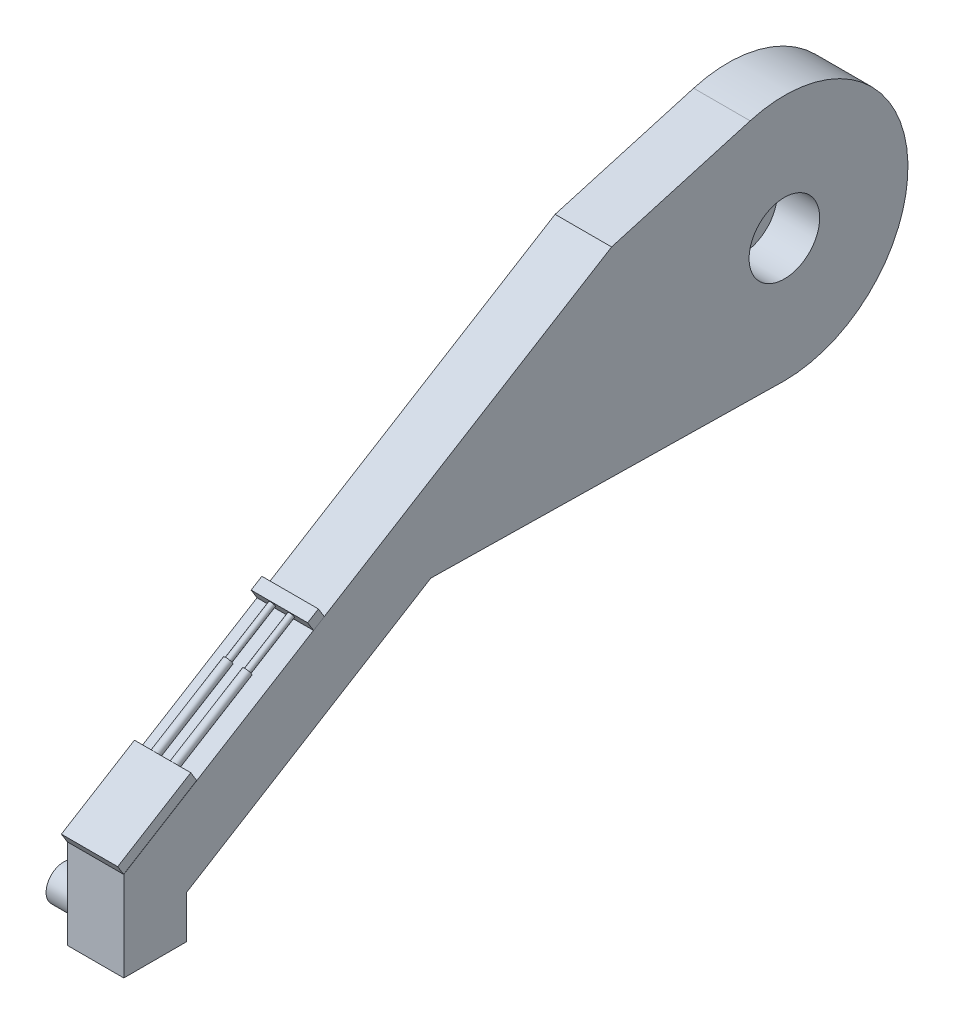
ISO-10303-21;
HEADER;
FILE_DESCRIPTION(('STEP AP214'),'2;1');
FILE_NAME('part.step','',(''),(''),'','','');
FILE_SCHEMA(('AUTOMOTIVE_DESIGN { 1 0 10303 214 1 1 1 1 }'));
ENDSEC;
DATA;
#1=APPLICATION_CONTEXT('core data for automotive mechanical design processes');
#2=APPLICATION_PROTOCOL_DEFINITION('international standard','automotive_design',2000,#1);
#3=PRODUCT_CONTEXT('',#1,'mechanical');
#4=PRODUCT('Part','Part','',(#3));
#5=PRODUCT_RELATED_PRODUCT_CATEGORY('part','',(#4));
#6=PRODUCT_DEFINITION_FORMATION('','',#4);
#7=PRODUCT_DEFINITION_CONTEXT('part definition',#1,'design');
#8=PRODUCT_DEFINITION('design','',#6,#7);
#9=PRODUCT_DEFINITION_SHAPE('','',#8);
#10=(LENGTH_UNIT() NAMED_UNIT(*) SI_UNIT(.MILLI.,.METRE.));
#11=(NAMED_UNIT(*) PLANE_ANGLE_UNIT() SI_UNIT($,.RADIAN.));
#12=(NAMED_UNIT(*) SI_UNIT($,.STERADIAN.) SOLID_ANGLE_UNIT());
#13=UNCERTAINTY_MEASURE_WITH_UNIT(LENGTH_MEASURE(1.E-05),#10,'distance_accuracy_value','');
#14=(GEOMETRIC_REPRESENTATION_CONTEXT(3) GLOBAL_UNCERTAINTY_ASSIGNED_CONTEXT((#13)) GLOBAL_UNIT_ASSIGNED_CONTEXT((#10,
#11,#12)) REPRESENTATION_CONTEXT('',''));
#15=CARTESIAN_POINT('',(0.,0.,0.));
#16=DIRECTION('',(0.,0.,1.));
#17=DIRECTION('',(1.,0.,0.));
#18=AXIS2_PLACEMENT_3D('',#15,#16,#17);
#19=CARTESIAN_POINT('',(80.,243.860961506672,-135.556846967238));
#20=DIRECTION('',(0.,-0.852159096550668,-0.523282786040158));
#21=DIRECTION('',(0.,0.523282786040158,-0.852159096550668));
#22=AXIS2_PLACEMENT_3D('',#19,#20,#21);
#23=PLANE('',#22);
#24=DIRECTION('',(0.,0.523282786040158,-0.852159096550668));
#25=VECTOR('',#24,1.);
#26=CARTESIAN_POINT('',(79.7425631618783,-116.81087603216,451.792470510164));
#27=LINE('',#26,#25);
#28=CARTESIAN_POINT('',(79.7425631618784,-180.334724000106,555.240216810827));
#29=VERTEX_POINT('',#28);
#30=CARTESIAN_POINT('',(79.7425631618783,-116.81087603216,451.792470510164));
#31=VERTEX_POINT('',#30);
#32=EDGE_CURVE('E71',#29,#31,#27,.T.);
#33=ORIENTED_EDGE('',*,*,#32,.F.);
#34=DIRECTION('',(-1.,0.,0.));
#35=VECTOR('',#34,1.);
#36=CARTESIAN_POINT('',(80.,-180.334724000106,555.240216810827));
#37=LINE('',#36,#35);
#38=CARTESIAN_POINT('',(80.,-180.334724000106,555.240216810827));
#39=VERTEX_POINT('',#38);
#40=EDGE_CURVE('E334',#39,#29,#37,.T.);
#41=ORIENTED_EDGE('',*,*,#40,.F.);
#42=DIRECTION('',(0.,-0.523282786040158,0.852159096550668));
#43=VECTOR('',#42,1.);
#44=CARTESIAN_POINT('',(80.,243.860961506672,-135.556846967238));
#45=LINE('',#44,#43);
#46=CARTESIAN_POINT('',(80.,-15.3543945600017,286.571932214281));
#47=VERTEX_POINT('',#46);
#48=EDGE_CURVE('E271',#47,#39,#45,.T.);
#49=ORIENTED_EDGE('',*,*,#48,.F.);
#50=DIRECTION('',(1.,0.,0.));
#51=VECTOR('',#50,1.);
#52=CARTESIAN_POINT('',(80.0913915254862,-15.3543945600017,286.571932214281));
#53=LINE('',#52,#51);
#54=CARTESIAN_POINT('',(0.,-15.3543945600017,286.571932214281));
#55=VERTEX_POINT('',#54);
#56=EDGE_CURVE('E234',#55,#47,#53,.T.);
#57=ORIENTED_EDGE('',*,*,#56,.F.);
#58=DIRECTION('',(0.,-0.523282786040158,0.852159096550668));
#59=VECTOR('',#58,1.);
#60=CARTESIAN_POINT('',(0.,243.860961506672,-135.556846967238));
#61=LINE('',#60,#59);
#62=CARTESIAN_POINT('',(0.,-116.81087603216,451.792470510164));
#63=VERTEX_POINT('',#62);
#64=EDGE_CURVE('E298',#55,#63,#61,.T.);
#65=ORIENTED_EDGE('',*,*,#64,.T.);
#66=DIRECTION('',(-1.,0.,0.));
#67=VECTOR('',#66,1.);
#68=CARTESIAN_POINT('',(79.7425631618783,-116.81087603216,451.792470510164));
#69=LINE('',#68,#67);
#70=EDGE_CURVE('E67',#31,#63,#69,.T.);
#71=ORIENTED_EDGE('',*,*,#70,.F.);
#72=EDGE_LOOP('',(#33,#41,#49,#57,#65,#71));
#73=FACE_BOUND('',#72,.T.);
#74=ADVANCED_FACE('F51',(#73),#23,.F.);
#75=DIRECTION('',(-1.,0.,0.));
#76=VECTOR('',#75,1.);
#77=CARTESIAN_POINT('',(80.0913915254862,-6.01484112769533,271.362592967165));
#78=LINE('',#77,#76);
#79=CARTESIAN_POINT('',(80.,-6.01484112769537,271.362592967165));
#80=VERTEX_POINT('',#79);
#81=CARTESIAN_POINT('',(0.,-6.01484112769537,271.362592967165));
#82=VERTEX_POINT('',#81);
#83=EDGE_CURVE('E230',#80,#82,#78,.T.);
#84=ORIENTED_EDGE('',*,*,#83,.F.);
#85=CARTESIAN_POINT('',(80.,243.860961506672,-135.556846967238));
#86=VERTEX_POINT('',#85);
#87=EDGE_CURVE('E272',#86,#80,#45,.T.);
#88=ORIENTED_EDGE('',*,*,#87,.F.);
#89=DIRECTION('',(-1.,0.,0.));
#90=VECTOR('',#89,1.);
#91=CARTESIAN_POINT('',(80.,243.860961506672,-135.556846967238));
#92=LINE('',#91,#90);
#93=CARTESIAN_POINT('',(0.,243.860961506672,-135.556846967238));
#94=VERTEX_POINT('',#93);
#95=EDGE_CURVE('E337',#86,#94,#92,.T.);
#96=ORIENTED_EDGE('',*,*,#95,.T.);
#97=EDGE_CURVE('E299',#94,#82,#61,.T.);
#98=ORIENTED_EDGE('',*,*,#97,.T.);
#99=EDGE_LOOP('',(#84,#88,#96,#98));
#100=FACE_BOUND('',#99,.T.);
#101=ADVANCED_FACE('F417',(#100),#23,.F.);
#102=CARTESIAN_POINT('',(80.,132.309134609545,-380.240216810827));
#103=DIRECTION('',(-1.,0.,0.));
#104=DIRECTION('',(0.,0.,1.));
#105=AXIS2_PLACEMENT_3D('',#102,#103,#104);
#106=CYLINDRICAL_SURFACE('',#105,175.);
#107=CARTESIAN_POINT('',(0.,132.309134609545,-380.240216810827));
#108=DIRECTION('',(1.,0.,0.));
#109=DIRECTION('',(0.,0.,-1.));
#110=AXIS2_PLACEMENT_3D('',#107,#108,#109);
#111=CIRCLE('',#110,175.);
#112=CARTESIAN_POINT('',(0.,-42.6908653904551,-380.240216810827));
#113=VERTEX_POINT('',#112);
#114=CARTESIAN_POINT('',(0.,300.452842372266,-331.735644451053));
#115=VERTEX_POINT('',#114);
#116=EDGE_CURVE('E259',#113,#115,#111,.T.);
#117=ORIENTED_EDGE('',*,*,#116,.T.);
#118=DIRECTION('',(-1.,0.,0.));
#119=VECTOR('',#118,1.);
#120=CARTESIAN_POINT('',(80.,300.452842372266,-331.735644451053));
#121=LINE('',#120,#119);
#122=CARTESIAN_POINT('',(80.,300.452842372266,-331.735644451053));
#123=VERTEX_POINT('',#122);
#124=EDGE_CURVE('E341',#123,#115,#121,.T.);
#125=ORIENTED_EDGE('',*,*,#124,.F.);
#126=CARTESIAN_POINT('',(80.,132.309134609545,-380.240216810827));
#127=DIRECTION('',(1.,0.,0.));
#128=DIRECTION('',(0.,0.,-1.));
#129=AXIS2_PLACEMENT_3D('',#126,#127,#128);
#130=CIRCLE('',#129,175.);
#131=CARTESIAN_POINT('',(80.,-42.6908653904551,-380.240216810827));
#132=VERTEX_POINT('',#131);
#133=EDGE_CURVE('E263',#132,#123,#130,.T.);
#134=ORIENTED_EDGE('',*,*,#133,.F.);
#135=DIRECTION('',(-1.,0.,0.));
#136=VECTOR('',#135,1.);
#137=CARTESIAN_POINT('',(80.,-42.6908653904551,-380.240216810827));
#138=LINE('',#137,#136);
#139=EDGE_CURVE('E291',#132,#113,#138,.T.);
#140=ORIENTED_EDGE('',*,*,#139,.T.);
#141=EDGE_LOOP('',(#117,#125,#134,#140));
#142=FACE_BOUND('',#141,.T.);
#143=ADVANCED_FACE('F53',(#142),#106,.T.);
#144=CARTESIAN_POINT('',(80.,300.452842372266,-331.735644451053));
#145=DIRECTION('',(0.,-0.96082118721555,-0.277168984912997));
#146=DIRECTION('',(0.,0.277168984912997,-0.96082118721555));
#147=AXIS2_PLACEMENT_3D('',#144,#145,#146);
#148=PLANE('',#147);
#149=DIRECTION('',(0.,-0.277168984912997,0.96082118721555));
#150=VECTOR('',#149,1.);
#151=CARTESIAN_POINT('',(0.,300.452842372266,-331.735644451053));
#152=LINE('',#151,#150);
#153=EDGE_CURVE('E295',#115,#94,#152,.T.);
#154=ORIENTED_EDGE('',*,*,#153,.T.);
#155=ORIENTED_EDGE('',*,*,#95,.F.);
#156=DIRECTION('',(0.,-0.277168984912997,0.96082118721555));
#157=VECTOR('',#156,1.);
#158=CARTESIAN_POINT('',(80.,300.452842372266,-331.735644451053));
#159=LINE('',#158,#157);
#160=EDGE_CURVE('E267',#123,#86,#159,.T.);
#161=ORIENTED_EDGE('',*,*,#160,.F.);
#162=ORIENTED_EDGE('',*,*,#124,.T.);
#163=EDGE_LOOP('',(#154,#155,#161,#162));
#164=FACE_BOUND('',#163,.T.);
#165=ADVANCED_FACE('F426',(#164),#148,.F.);
#166=CARTESIAN_POINT('',(80.,-180.334724000106,555.240216810827));
#167=DIRECTION('',(0.,0.,-1.));
#168=DIRECTION('',(-1.,0.,0.));
#169=AXIS2_PLACEMENT_3D('',#166,#167,#168);
#170=PLANE('',#169);
#171=DIRECTION('',(0.,-1.,0.));
#172=VECTOR('',#171,1.);
#173=CARTESIAN_POINT('',(0.,-180.334724000106,555.240216810827));
#174=LINE('',#173,#172);
#175=CARTESIAN_POINT('',(0.,-180.334724000106,555.240216810827));
#176=VERTEX_POINT('',#175);
#177=CARTESIAN_POINT('',(0.,-307.309134609545,555.240216810827));
#178=VERTEX_POINT('',#177);
#179=EDGE_CURVE('E193',#176,#178,#174,.T.);
#180=ORIENTED_EDGE('',*,*,#179,.T.);
#181=DIRECTION('',(-1.,0.,0.));
#182=VECTOR('',#181,1.);
#183=CARTESIAN_POINT('',(80.,-307.309134609545,555.240216810827));
#184=LINE('',#183,#182);
#185=CARTESIAN_POINT('',(80.,-307.309134609545,555.240216810827));
#186=VERTEX_POINT('',#185);
#187=EDGE_CURVE('E330',#186,#178,#184,.T.);
#188=ORIENTED_EDGE('',*,*,#187,.F.);
#189=DIRECTION('',(0.,-1.,0.));
#190=VECTOR('',#189,1.);
#191=CARTESIAN_POINT('',(80.,-180.334724000106,555.240216810827));
#192=LINE('',#191,#190);
#193=EDGE_CURVE('E276',#39,#186,#192,.T.);
#194=ORIENTED_EDGE('',*,*,#193,.F.);
#195=ORIENTED_EDGE('',*,*,#40,.T.);
#196=DIRECTION('',(1.,0.,0.));
#197=VECTOR('',#196,1.);
#198=CARTESIAN_POINT('',(79.7425631618784,-180.334724000106,555.240216810827));
#199=LINE('',#198,#197);
#200=EDGE_CURVE('E238',#176,#29,#199,.T.);
#201=ORIENTED_EDGE('',*,*,#200,.F.);
#202=EDGE_LOOP('',(#180,#188,#194,#195,#201));
#203=FACE_BOUND('',#202,.T.);
#204=ADVANCED_FACE('F424',(#203),#170,.F.);
#205=CARTESIAN_POINT('',(80.,-307.309134609545,555.240216810827));
#206=DIRECTION('',(0.,1.,0.));
#207=DIRECTION('',(0.,0.,1.));
#208=AXIS2_PLACEMENT_3D('',#205,#206,#207);
#209=PLANE('',#208);
#210=DIRECTION('',(0.,0.,-1.));
#211=VECTOR('',#210,1.);
#212=CARTESIAN_POINT('',(0.,-307.309134609545,555.240216810827));
#213=LINE('',#212,#211);
#214=CARTESIAN_POINT('',(0.,-307.309134609545,466.406773100588));
#215=VERTEX_POINT('',#214);
#216=EDGE_CURVE('E304',#178,#215,#213,.T.);
#217=ORIENTED_EDGE('',*,*,#216,.T.);
#218=DIRECTION('',(-1.,0.,0.));
#219=VECTOR('',#218,1.);
#220=CARTESIAN_POINT('',(80.,-307.309134609545,466.406773100588));
#221=LINE('',#220,#219);
#222=CARTESIAN_POINT('',(80.,-307.309134609545,466.406773100588));
#223=VERTEX_POINT('',#222);
#224=EDGE_CURVE('E326',#223,#215,#221,.T.);
#225=ORIENTED_EDGE('',*,*,#224,.F.);
#226=DIRECTION('',(0.,0.,-1.));
#227=VECTOR('',#226,1.);
#228=CARTESIAN_POINT('',(80.,-307.309134609545,555.240216810827));
#229=LINE('',#228,#227);
#230=EDGE_CURVE('E279',#186,#223,#229,.T.);
#231=ORIENTED_EDGE('',*,*,#230,.F.);
#232=ORIENTED_EDGE('',*,*,#187,.T.);
#233=EDGE_LOOP('',(#217,#225,#231,#232));
#234=FACE_BOUND('',#233,.T.);
#235=ADVANCED_FACE('F433',(#234),#209,.F.);
#236=CARTESIAN_POINT('',(80.,-307.309134609545,466.406773100588));
#237=DIRECTION('',(0.,0.,1.));
#238=DIRECTION('',(1.,0.,0.));
#239=AXIS2_PLACEMENT_3D('',#236,#237,#238);
#240=PLANE('',#239);
#241=DIRECTION('',(0.,1.,0.));
#242=VECTOR('',#241,1.);
#243=CARTESIAN_POINT('',(0.,-307.309134609545,466.406773100588));
#244=LINE('',#243,#242);
#245=CARTESIAN_POINT('',(0.,-246.770086345949,466.406773100588));
#246=VERTEX_POINT('',#245);
#247=EDGE_CURVE('E307',#215,#246,#244,.T.);
#248=ORIENTED_EDGE('',*,*,#247,.T.);
#249=DIRECTION('',(-1.,0.,0.));
#250=VECTOR('',#249,1.);
#251=CARTESIAN_POINT('',(80.,-246.770086345949,466.406773100588));
#252=LINE('',#251,#250);
#253=CARTESIAN_POINT('',(80.,-246.770086345949,466.406773100588));
#254=VERTEX_POINT('',#253);
#255=EDGE_CURVE('E322',#254,#246,#252,.T.);
#256=ORIENTED_EDGE('',*,*,#255,.F.);
#257=DIRECTION('',(0.,1.,0.));
#258=VECTOR('',#257,1.);
#259=CARTESIAN_POINT('',(80.,-307.309134609545,466.406773100588));
#260=LINE('',#259,#258);
#261=EDGE_CURVE('E282',#223,#254,#260,.T.);
#262=ORIENTED_EDGE('',*,*,#261,.F.);
#263=ORIENTED_EDGE('',*,*,#224,.T.);
#264=EDGE_LOOP('',(#248,#256,#262,#263));
#265=FACE_BOUND('',#264,.T.);
#266=ADVANCED_FACE('F478',(#265),#240,.F.);
#267=CARTESIAN_POINT('',(80.,-246.770086345949,466.406773100588));
#268=DIRECTION('',(0.,0.852159096550668,0.523282786040158));
#269=DIRECTION('',(0.,-0.523282786040158,0.852159096550668));
#270=AXIS2_PLACEMENT_3D('',#267,#268,#269);
#271=PLANE('',#270);
#272=DIRECTION('',(0.,0.523282786040158,-0.852159096550668));
#273=VECTOR('',#272,1.);
#274=CARTESIAN_POINT('',(0.,-246.770086345949,466.406773100588));
#275=LINE('',#274,#273);
#276=CARTESIAN_POINT('',(0.,-34.2881116091123,120.382687356731));
#277=VERTEX_POINT('',#276);
#278=EDGE_CURVE('E310',#246,#277,#275,.T.);
#279=ORIENTED_EDGE('',*,*,#278,.T.);
#280=DIRECTION('',(-1.,0.,0.));
#281=VECTOR('',#280,1.);
#282=CARTESIAN_POINT('',(80.,-34.2881116091123,120.382687356731));
#283=LINE('',#282,#281);
#284=CARTESIAN_POINT('',(80.,-34.2881116091123,120.382687356731));
#285=VERTEX_POINT('',#284);
#286=EDGE_CURVE('E318',#285,#277,#283,.T.);
#287=ORIENTED_EDGE('',*,*,#286,.F.);
#288=DIRECTION('',(0.,0.523282786040158,-0.852159096550668));
#289=VECTOR('',#288,1.);
#290=CARTESIAN_POINT('',(80.,-246.770086345949,466.406773100588));
#291=LINE('',#290,#289);
#292=EDGE_CURVE('E285',#254,#285,#291,.T.);
#293=ORIENTED_EDGE('',*,*,#292,.F.);
#294=ORIENTED_EDGE('',*,*,#255,.T.);
#295=EDGE_LOOP('',(#279,#287,#293,#294));
#296=FACE_BOUND('',#295,.T.);
#297=ADVANCED_FACE('F474',(#296),#271,.F.);
#298=CARTESIAN_POINT('',(80.,-34.2881116091123,120.382687356731));
#299=DIRECTION('',(0.,0.999859168404788,-0.016782233370033));
#300=DIRECTION('',(0.,0.016782233370033,0.999859168404788));
#301=AXIS2_PLACEMENT_3D('',#298,#299,#300);
#302=PLANE('',#301);
#303=DIRECTION('',(0.,-0.016782233370033,-0.999859168404788));
#304=VECTOR('',#303,1.);
#305=CARTESIAN_POINT('',(0.,-34.2881116091123,120.382687356731));
#306=LINE('',#305,#304);
#307=EDGE_CURVE('E268',#277,#113,#306,.T.);
#308=ORIENTED_EDGE('',*,*,#307,.T.);
#309=ORIENTED_EDGE('',*,*,#139,.F.);
#310=DIRECTION('',(0.,-0.016782233370033,-0.999859168404788));
#311=VECTOR('',#310,1.);
#312=CARTESIAN_POINT('',(80.,-34.2881116091123,120.382687356731));
#313=LINE('',#312,#311);
#314=EDGE_CURVE('E288',#285,#132,#313,.T.);
#315=ORIENTED_EDGE('',*,*,#314,.F.);
#316=ORIENTED_EDGE('',*,*,#286,.T.);
#317=EDGE_LOOP('',(#308,#309,#315,#316));
#318=FACE_BOUND('',#317,.T.);
#319=ADVANCED_FACE('F470',(#318),#302,.F.);
#320=CARTESIAN_POINT('',(80.,132.309134609545,-380.240216810827));
#321=DIRECTION('',(1.,0.,0.));
#322=DIRECTION('',(0.,0.,-1.));
#323=AXIS2_PLACEMENT_3D('',#320,#321,#322);
#324=PLANE('',#323);
#325=CARTESIAN_POINT('',(80.,132.309134609545,-380.240216810827));
#326=DIRECTION('',(1.,0.,0.));
#327=DIRECTION('',(0.,0.,-1.));
#328=AXIS2_PLACEMENT_3D('',#325,#326,#327);
#329=CIRCLE('',#328,50.);
#330=CARTESIAN_POINT('',(80.,132.309134609545,-430.240216810827));
#331=VERTEX_POINT('',#330);
#332=EDGE_CURVE('E254',#331,#331,#329,.T.);
#333=ORIENTED_EDGE('',*,*,#332,.F.);
#334=EDGE_LOOP('',(#333));
#335=FACE_BOUND('',#334,.T.);
#336=ORIENTED_EDGE('',*,*,#133,.T.);
#337=ORIENTED_EDGE('',*,*,#160,.T.);
#338=ORIENTED_EDGE('',*,*,#87,.T.);
#339=DIRECTION('',(0.,0.523282786040159,-0.852159096550667));
#340=VECTOR('',#339,1.);
#341=CARTESIAN_POINT('',(80.,322.424550382445,-263.496612432825));
#342=LINE('',#341,#340);
#343=EDGE_CURVE('E196',#47,#80,#342,.T.);
#344=ORIENTED_EDGE('',*,*,#343,.F.);
#345=ORIENTED_EDGE('',*,*,#48,.T.);
#346=ORIENTED_EDGE('',*,*,#193,.T.);
#347=ORIENTED_EDGE('',*,*,#230,.T.);
#348=ORIENTED_EDGE('',*,*,#261,.T.);
#349=ORIENTED_EDGE('',*,*,#292,.T.);
#350=ORIENTED_EDGE('',*,*,#314,.T.);
#351=EDGE_LOOP('',(#336,#337,#338,#344,#345,#346,#347,#348,#349,#350));
#352=FACE_BOUND('',#351,.T.);
#353=ADVANCED_FACE('F462',(#335,#352),#324,.T.);
#354=CARTESIAN_POINT('',(0.,132.309134609545,-380.240216810827));
#355=DIRECTION('',(1.,0.,0.));
#356=DIRECTION('',(0.,0.,-1.));
#357=AXIS2_PLACEMENT_3D('',#354,#355,#356);
#358=PLANE('',#357);
#359=CARTESIAN_POINT('',(0.,-277.309134609545,510.240216810827));
#360=DIRECTION('',(1.,0.,0.));
#361=DIRECTION('',(0.,0.,-1.));
#362=AXIS2_PLACEMENT_3D('',#359,#360,#361);
#363=CIRCLE('',#362,25.);
#364=CARTESIAN_POINT('',(0.,-277.309134609545,485.240216810827));
#365=VERTEX_POINT('',#364);
#366=EDGE_CURVE('E345',#365,#365,#363,.F.);
#367=ORIENTED_EDGE('',*,*,#366,.F.);
#368=EDGE_LOOP('',(#367));
#369=FACE_BOUND('',#368,.T.);
#370=ORIENTED_EDGE('',*,*,#116,.F.);
#371=ORIENTED_EDGE('',*,*,#307,.F.);
#372=ORIENTED_EDGE('',*,*,#278,.F.);
#373=ORIENTED_EDGE('',*,*,#247,.F.);
#374=ORIENTED_EDGE('',*,*,#216,.F.);
#375=ORIENTED_EDGE('',*,*,#179,.F.);
#376=DIRECTION('',(0.,-0.852159096550668,-0.523282786040158));
#377=VECTOR('',#376,1.);
#378=CARTESIAN_POINT('',(0.,-166.700178455295,563.61274138747));
#379=LINE('',#378,#377);
#380=CARTESIAN_POINT('',(0.,-166.700178455295,563.61274138747));
#381=VERTEX_POINT('',#380);
#382=EDGE_CURVE('E172',#381,#176,#379,.T.);
#383=ORIENTED_EDGE('',*,*,#382,.F.);
#384=DIRECTION('',(0.,-0.523282786040158,0.852159096550668));
#385=VECTOR('',#384,1.);
#386=CARTESIAN_POINT('',(0.,-103.17633048735,460.164995086807));
#387=LINE('',#386,#385);
#388=CARTESIAN_POINT('',(0.,-103.17633048735,460.164995086807));
#389=VERTEX_POINT('',#388);
#390=EDGE_CURVE('E179',#389,#381,#387,.T.);
#391=ORIENTED_EDGE('',*,*,#390,.F.);
#392=DIRECTION('',(0.,-0.852159096550668,-0.523282786040158));
#393=VECTOR('',#392,1.);
#394=CARTESIAN_POINT('',(0.,-103.17633048735,460.164995086807));
#395=LINE('',#394,#393);
#396=EDGE_CURVE('E369',#389,#63,#395,.T.);
#397=ORIENTED_EDGE('',*,*,#396,.T.);
#398=ORIENTED_EDGE('',*,*,#64,.F.);
#399=DIRECTION('',(0.,-0.852159096550668,-0.523282786040158));
#400=VECTOR('',#399,1.);
#401=CARTESIAN_POINT('',(0.,-1.71984901519101,294.944456790924));
#402=LINE('',#401,#400);
#403=CARTESIAN_POINT('',(0.,-1.71984901519101,294.944456790924));
#404=VERTEX_POINT('',#403);
#405=EDGE_CURVE('E207',#404,#55,#402,.T.);
#406=ORIENTED_EDGE('',*,*,#405,.F.);
#407=DIRECTION('',(0.,-0.523282786040159,0.852159096550667));
#408=VECTOR('',#407,1.);
#409=CARTESIAN_POINT('',(0.,7.61970441711535,279.735117543808));
#410=LINE('',#409,#408);
#411=CARTESIAN_POINT('',(0.,7.61970441711535,279.735117543808));
#412=VERTEX_POINT('',#411);
#413=EDGE_CURVE('E247',#412,#404,#410,.T.);
#414=ORIENTED_EDGE('',*,*,#413,.F.);
#415=DIRECTION('',(0.,-0.852159096550668,-0.523282786040158));
#416=VECTOR('',#415,1.);
#417=CARTESIAN_POINT('',(0.,7.61970441711535,279.735117543808));
#418=LINE('',#417,#416);
#419=EDGE_CURVE('E220',#412,#82,#418,.T.);
#420=ORIENTED_EDGE('',*,*,#419,.T.);
#421=ORIENTED_EDGE('',*,*,#97,.F.);
#422=ORIENTED_EDGE('',*,*,#153,.F.);
#423=EDGE_LOOP('',(#370,#371,#372,#373,#374,#375,#383,#391,#397,#398,#406,#414,#420,#421,#422));
#424=FACE_BOUND('',#423,.T.);
#425=ADVANCED_FACE('F191',(#369,#424),#358,.F.);
#426=CARTESIAN_POINT('',(20.,132.309134609545,-380.240216810827));
#427=DIRECTION('',(1.,0.,0.));
#428=DIRECTION('',(0.,0.,-1.));
#429=AXIS2_PLACEMENT_3D('',#426,#427,#428);
#430=CYLINDRICAL_SURFACE('',#429,50.);
#431=CARTESIAN_POINT('',(20.,132.309134609545,-380.240216810827));
#432=DIRECTION('',(1.,0.,0.));
#433=DIRECTION('',(0.,0.,-1.));
#434=AXIS2_PLACEMENT_3D('',#431,#432,#433);
#435=CIRCLE('',#434,50.);
#436=CARTESIAN_POINT('',(20.,132.309134609545,-430.240216810827));
#437=VERTEX_POINT('',#436);
#438=EDGE_CURVE('E255',#437,#437,#435,.T.);
#439=CARTESIAN_POINT('',(20.,132.309134609545,-430.240216810827));
#440=CARTESIAN_POINT('',(20.625,132.309134609545,-430.240216810827));
#441=CARTESIAN_POINT('',(21.25,132.309134609545,-430.240216810827));
#442=CARTESIAN_POINT('',(22.5,132.309134609545,-430.240216810827));
#443=CARTESIAN_POINT('',(23.125,132.309134609545,-430.240216810827));
#444=CARTESIAN_POINT('',(24.375,132.309134609545,-430.240216810827));
#445=CARTESIAN_POINT('',(25.,132.309134609545,-430.240216810827));
#446=CARTESIAN_POINT('',(26.25,132.309134609545,-430.240216810827));
#447=CARTESIAN_POINT('',(26.875,132.309134609545,-430.240216810827));
#448=CARTESIAN_POINT('',(28.125,132.309134609545,-430.240216810827));
#449=CARTESIAN_POINT('',(28.75,132.309134609545,-430.240216810827));
#450=CARTESIAN_POINT('',(30.,132.309134609545,-430.240216810827));
#451=CARTESIAN_POINT('',(30.625,132.309134609545,-430.240216810827));
#452=CARTESIAN_POINT('',(31.875,132.309134609545,-430.240216810827));
#453=CARTESIAN_POINT('',(32.5,132.309134609545,-430.240216810827));
#454=CARTESIAN_POINT('',(33.75,132.309134609545,-430.240216810827));
#455=CARTESIAN_POINT('',(34.375,132.309134609545,-430.240216810827));
#456=CARTESIAN_POINT('',(35.625,132.309134609545,-430.240216810827));
#457=CARTESIAN_POINT('',(36.25,132.309134609545,-430.240216810827));
#458=CARTESIAN_POINT('',(37.5,132.309134609545,-430.240216810827));
#459=CARTESIAN_POINT('',(38.125,132.309134609545,-430.240216810827));
#460=CARTESIAN_POINT('',(39.375,132.309134609545,-430.240216810827));
#461=CARTESIAN_POINT('',(40.,132.309134609545,-430.240216810827));
#462=CARTESIAN_POINT('',(41.25,132.309134609545,-430.240216810827));
#463=CARTESIAN_POINT('',(41.875,132.309134609545,-430.240216810827));
#464=CARTESIAN_POINT('',(43.125,132.309134609545,-430.240216810827));
#465=CARTESIAN_POINT('',(43.75,132.309134609545,-430.240216810827));
#466=CARTESIAN_POINT('',(45.,132.309134609545,-430.240216810827));
#467=CARTESIAN_POINT('',(45.625,132.309134609545,-430.240216810827));
#468=CARTESIAN_POINT('',(46.875,132.309134609545,-430.240216810827));
#469=CARTESIAN_POINT('',(47.5,132.309134609545,-430.240216810827));
#470=CARTESIAN_POINT('',(48.75,132.309134609545,-430.240216810827));
#471=CARTESIAN_POINT('',(49.375,132.309134609545,-430.240216810827));
#472=CARTESIAN_POINT('',(50.625,132.309134609545,-430.240216810827));
#473=CARTESIAN_POINT('',(51.25,132.309134609545,-430.240216810827));
#474=CARTESIAN_POINT('',(52.5,132.309134609545,-430.240216810827));
#475=CARTESIAN_POINT('',(53.125,132.309134609545,-430.240216810827));
#476=CARTESIAN_POINT('',(54.375,132.309134609545,-430.240216810827));
#477=CARTESIAN_POINT('',(55.,132.309134609545,-430.240216810827));
#478=CARTESIAN_POINT('',(56.25,132.309134609545,-430.240216810827));
#479=CARTESIAN_POINT('',(56.875,132.309134609545,-430.240216810827));
#480=CARTESIAN_POINT('',(58.125,132.309134609545,-430.240216810827));
#481=CARTESIAN_POINT('',(58.75,132.309134609545,-430.240216810827));
#482=CARTESIAN_POINT('',(60.,132.309134609545,-430.240216810827));
#483=CARTESIAN_POINT('',(60.625,132.309134609545,-430.240216810827));
#484=CARTESIAN_POINT('',(61.875,132.309134609545,-430.240216810827));
#485=CARTESIAN_POINT('',(62.5,132.309134609545,-430.240216810827));
#486=CARTESIAN_POINT('',(63.75,132.309134609545,-430.240216810827));
#487=CARTESIAN_POINT('',(64.375,132.309134609545,-430.240216810827));
#488=CARTESIAN_POINT('',(65.625,132.309134609545,-430.240216810827));
#489=CARTESIAN_POINT('',(66.25,132.309134609545,-430.240216810827));
#490=CARTESIAN_POINT('',(67.5,132.309134609545,-430.240216810827));
#491=CARTESIAN_POINT('',(68.125,132.309134609545,-430.240216810827));
#492=CARTESIAN_POINT('',(69.375,132.309134609545,-430.240216810827));
#493=CARTESIAN_POINT('',(70.,132.309134609545,-430.240216810827));
#494=CARTESIAN_POINT('',(71.25,132.309134609545,-430.240216810827));
#495=CARTESIAN_POINT('',(71.875,132.309134609545,-430.240216810827));
#496=CARTESIAN_POINT('',(73.125,132.309134609545,-430.240216810827));
#497=CARTESIAN_POINT('',(73.75,132.309134609545,-430.240216810827));
#498=CARTESIAN_POINT('',(75.,132.309134609545,-430.240216810827));
#499=CARTESIAN_POINT('',(75.625,132.309134609545,-430.240216810827));
#500=CARTESIAN_POINT('',(76.875,132.309134609545,-430.240216810827));
#501=CARTESIAN_POINT('',(77.5,132.309134609545,-430.240216810827));
#502=CARTESIAN_POINT('',(78.75,132.309134609545,-430.240216810827));
#503=CARTESIAN_POINT('',(79.375,132.309134609545,-430.240216810827));
#504=CARTESIAN_POINT('',(80.,132.309134609545,-430.240216810827));
#505=B_SPLINE_CURVE_WITH_KNOTS('',3,(#439,#440,#441,#442,#443,#444,#445,#446,#447,#448,#449,
#450,#451,#452,#453,#454,#455,#456,#457,#458,#459,#460,#461,#462,#463,#464,#465,#466,#467,#468,
#469,#470,#471,#472,#473,#474,#475,#476,#477,#478,#479,#480,#481,#482,#483,#484,#485,#486,#487,
#488,#489,#490,#491,#492,#493,#494,#495,#496,#497,#498,#499,#500,#501,#502,#503,#504),
.UNSPECIFIED.,.F.,.F.,(4,2,2,2,2,2,2,2,2,2,2,2,2,2,2,2,2,2,2,2,2,2,2,2,2,2,2,2,2,2,2,2,4),(0.,
1.875,3.75,5.625,7.5,9.375,11.25,13.125,15.,16.875,18.75,20.625,22.5,24.375,26.25,28.125,30.,
31.875,33.75,35.625,37.5,39.375,41.25,43.125,45.,46.875,48.75,50.625,52.5,54.375,56.25,58.125,
60.),.UNSPECIFIED.);
#506=EDGE_CURVE('BSEAM517',#437,#331,#505,.T.);
#507=ORIENTED_EDGE('',*,*,#438,.F.);
#508=ORIENTED_EDGE('',*,*,#332,.T.);
#509=ORIENTED_EDGE('',*,*,#506,.T.);
#510=ORIENTED_EDGE('',*,*,#506,.F.);
#511=EDGE_LOOP('',(#507,#509,#508,#510));
#512=FACE_BOUND('',#511,.T.);
#513=ADVANCED_FACE('F517',(#512),#430,.F.);
#514=CARTESIAN_POINT('',(20.,132.309134609545,-380.240216810827));
#515=DIRECTION('',(1.,0.,0.));
#516=DIRECTION('',(0.,0.,-1.));
#517=AXIS2_PLACEMENT_3D('',#514,#515,#516);
#518=PLANE('',#517);
#519=ORIENTED_EDGE('',*,*,#438,.T.);
#520=EDGE_LOOP('',(#519));
#521=FACE_BOUND('',#520,.T.);
#522=ADVANCED_FACE('F513',(#521),#518,.T.);
#523=CARTESIAN_POINT('',(-50.,-277.309134609545,510.240216810827));
#524=DIRECTION('',(1.,0.,0.));
#525=DIRECTION('',(0.,0.,-1.));
#526=AXIS2_PLACEMENT_3D('',#523,#524,#525);
#527=CYLINDRICAL_SURFACE('',#526,25.);
#528=CARTESIAN_POINT('',(-50.,-277.309134609545,510.240216810827));
#529=DIRECTION('',(-1.,0.,0.));
#530=DIRECTION('',(0.,0.,1.));
#531=AXIS2_PLACEMENT_3D('',#528,#529,#530);
#532=CIRCLE('',#531,25.);
#533=CARTESIAN_POINT('',(-50.,-277.309134609545,535.240216810827));
#534=VERTEX_POINT('',#533);
#535=EDGE_CURVE('E201',#534,#534,#532,.T.);
#536=ORIENTED_EDGE('',*,*,#535,.F.);
#537=EDGE_LOOP('',(#536));
#538=FACE_BOUND('',#537,.T.);
#539=ORIENTED_EDGE('',*,*,#366,.T.);
#540=EDGE_LOOP('',(#539));
#541=FACE_BOUND('',#540,.T.);
#542=ADVANCED_FACE('F509',(#538,#541),#527,.T.);
#543=CARTESIAN_POINT('',(-50.,-277.309134609545,510.240216810827));
#544=DIRECTION('',(-1.,0.,0.));
#545=DIRECTION('',(0.,0.,1.));
#546=AXIS2_PLACEMENT_3D('',#543,#544,#545);
#547=PLANE('',#546);
#548=ORIENTED_EDGE('',*,*,#535,.T.);
#549=EDGE_LOOP('',(#548));
#550=FACE_BOUND('',#549,.T.);
#551=ADVANCED_FACE('F495',(#550),#547,.T.);
#552=CARTESIAN_POINT('',(80.0913915254862,-1.71984901519101,294.944456790924));
#553=DIRECTION('',(0.,0.523282786040158,-0.852159096550668));
#554=DIRECTION('',(0.,0.852159096550668,0.523282786040158));
#555=AXIS2_PLACEMENT_3D('',#552,#553,#554);
#556=PLANE('',#555);
#557=CARTESIAN_POINT('',(26.3809614510638,-7.19027728634247,291.585247274593));
#558=DIRECTION('',(0.,0.523282786040158,-0.852159096550668));
#559=DIRECTION('',(0.,0.852159096550668,0.523282786040158));
#560=AXIS2_PLACEMENT_3D('',#557,#558,#559);
#561=CIRCLE('',#560,4.2401248833438);
#562=CARTESIAN_POINT('',(26.3809614510638,-3.57701629649021,293.804031636707));
#563=VERTEX_POINT('',#562);
#564=EDGE_CURVE('E353',#563,#563,#561,.F.);
#565=ORIENTED_EDGE('',*,*,#564,.F.);
#566=EDGE_LOOP('',(#565));
#567=FACE_BOUND('',#566,.T.);
#568=CARTESIAN_POINT('',(53.3616017108145,-7.19027728634247,291.585247274593));
#569=DIRECTION('',(0.,0.523282786040158,-0.852159096550668));
#570=DIRECTION('',(0.,0.852159096550668,0.523282786040158));
#571=AXIS2_PLACEMENT_3D('',#568,#569,#570);
#572=CIRCLE('',#571,4.2401248833438);
#573=CARTESIAN_POINT('',(53.3616017108145,-3.57701629649022,293.804031636707));
#574=VERTEX_POINT('',#573);
#575=EDGE_CURVE('E349',#574,#574,#572,.F.);
#576=ORIENTED_EDGE('',*,*,#575,.F.);
#577=EDGE_LOOP('',(#576));
#578=FACE_BOUND('',#577,.T.);
#579=ORIENTED_EDGE('',*,*,#56,.T.);
#580=CARTESIAN_POINT('',(80.0913915254862,-15.3543945600017,286.571932214281));
#581=VERTEX_POINT('',#580);
#582=EDGE_CURVE('E233',#47,#581,#53,.T.);
#583=ORIENTED_EDGE('',*,*,#582,.T.);
#584=DIRECTION('',(0.,-0.852159096550668,-0.523282786040158));
#585=VECTOR('',#584,1.);
#586=CARTESIAN_POINT('',(80.0913915254862,-1.71984901519101,294.944456790924));
#587=LINE('',#586,#585);
#588=CARTESIAN_POINT('',(80.0913915254862,-1.71984901519101,294.944456790924));
#589=VERTEX_POINT('',#588);
#590=EDGE_CURVE('E211',#589,#581,#587,.T.);
#591=ORIENTED_EDGE('',*,*,#590,.F.);
#592=DIRECTION('',(1.,0.,0.));
#593=VECTOR('',#592,1.);
#594=CARTESIAN_POINT('',(80.0913915254862,-1.71984901519101,294.944456790924));
#595=LINE('',#594,#593);
#596=EDGE_CURVE('E244',#404,#589,#595,.T.);
#597=ORIENTED_EDGE('',*,*,#596,.F.);
#598=ORIENTED_EDGE('',*,*,#405,.T.);
#599=EDGE_LOOP('',(#579,#583,#591,#597,#598));
#600=FACE_BOUND('',#599,.T.);
#601=ADVANCED_FACE('F452',(#567,#578,#600),#556,.F.);
#602=CARTESIAN_POINT('',(80.0913915254862,7.61970441711535,279.735117543808));
#603=DIRECTION('',(-1.,0.,0.));
#604=DIRECTION('',(0.,0.,1.));
#605=AXIS2_PLACEMENT_3D('',#602,#603,#604);
#606=PLANE('',#605);
#607=DIRECTION('',(0.,0.523282786040159,-0.852159096550667));
#608=VECTOR('',#607,1.);
#609=CARTESIAN_POINT('',(80.0913915254862,-6.01484112769533,271.362592967165));
#610=LINE('',#609,#608);
#611=CARTESIAN_POINT('',(80.0913915254862,-6.01484112769533,271.362592967165));
#612=VERTEX_POINT('',#611);
#613=EDGE_CURVE('E229',#581,#612,#610,.T.);
#614=ORIENTED_EDGE('',*,*,#613,.T.);
#615=DIRECTION('',(0.,-0.852159096550668,-0.523282786040158));
#616=VECTOR('',#615,1.);
#617=CARTESIAN_POINT('',(80.0913915254862,7.61970441711535,279.735117543808));
#618=LINE('',#617,#616);
#619=CARTESIAN_POINT('',(80.0913915254862,7.61970441711535,279.735117543808));
#620=VERTEX_POINT('',#619);
#621=EDGE_CURVE('E216',#620,#612,#618,.T.);
#622=ORIENTED_EDGE('',*,*,#621,.F.);
#623=DIRECTION('',(0.,0.523282786040159,-0.852159096550667));
#624=VECTOR('',#623,1.);
#625=CARTESIAN_POINT('',(80.0913915254862,7.61970441711535,279.735117543808));
#626=LINE('',#625,#624);
#627=EDGE_CURVE('E241',#589,#620,#626,.T.);
#628=ORIENTED_EDGE('',*,*,#627,.F.);
#629=ORIENTED_EDGE('',*,*,#590,.T.);
#630=EDGE_LOOP('',(#614,#622,#628,#629));
#631=FACE_BOUND('',#630,.T.);
#632=ADVANCED_FACE('F457',(#631),#606,.F.);
#633=CARTESIAN_POINT('',(80.0913915254862,7.61970441711535,279.735117543808));
#634=DIRECTION('',(0.,-0.523282786040158,0.852159096550668));
#635=DIRECTION('',(0.,-0.852159096550668,-0.523282786040158));
#636=AXIS2_PLACEMENT_3D('',#633,#634,#635);
#637=PLANE('',#636);
#638=EDGE_CURVE('E225',#612,#80,#78,.T.);
#639=ORIENTED_EDGE('',*,*,#638,.T.);
#640=ORIENTED_EDGE('',*,*,#83,.T.);
#641=ORIENTED_EDGE('',*,*,#419,.F.);
#642=DIRECTION('',(-1.,0.,0.));
#643=VECTOR('',#642,1.);
#644=CARTESIAN_POINT('',(80.0913915254862,7.61970441711535,279.735117543808));
#645=LINE('',#644,#643);
#646=EDGE_CURVE('E224',#620,#412,#645,.T.);
#647=ORIENTED_EDGE('',*,*,#646,.F.);
#648=ORIENTED_EDGE('',*,*,#621,.T.);
#649=EDGE_LOOP('',(#639,#640,#641,#647,#648));
#650=FACE_BOUND('',#649,.T.);
#651=ADVANCED_FACE('F445',(#650),#637,.F.);
#652=CARTESIAN_POINT('',(0.,130.272775513632,79.9962133736424));
#653=DIRECTION('',(0.,-0.852159096550667,-0.523282786040159));
#654=DIRECTION('',(0.,0.523282786040159,-0.852159096550667));
#655=AXIS2_PLACEMENT_3D('',#652,#653,#654);
#656=PLANE('',#655);
#657=ORIENTED_EDGE('',*,*,#413,.T.);
#658=ORIENTED_EDGE('',*,*,#596,.T.);
#659=ORIENTED_EDGE('',*,*,#627,.T.);
#660=ORIENTED_EDGE('',*,*,#646,.T.);
#661=EDGE_LOOP('',(#657,#658,#659,#660));
#662=FACE_BOUND('',#661,.T.);
#663=ADVANCED_FACE('F501',(#662),#656,.F.);
#664=CARTESIAN_POINT('',(0.,116.638229968821,71.6236887969999));
#665=DIRECTION('',(0.,-0.852159096550667,-0.523282786040159));
#666=DIRECTION('',(0.,0.523282786040159,-0.852159096550667));
#667=AXIS2_PLACEMENT_3D('',#664,#665,#666);
#668=PLANE('',#667);
#669=ORIENTED_EDGE('',*,*,#582,.F.);
#670=ORIENTED_EDGE('',*,*,#343,.T.);
#671=ORIENTED_EDGE('',*,*,#638,.F.);
#672=ORIENTED_EDGE('',*,*,#613,.F.);
#673=EDGE_LOOP('',(#669,#670,#671,#672));
#674=FACE_BOUND('',#673,.T.);
#675=ADVANCED_FACE('F459',(#674),#668,.T.);
#676=CARTESIAN_POINT('',(79.7425631618784,-166.700178455295,563.61274138747));
#677=DIRECTION('',(0.,0.523282786040158,-0.852159096550668));
#678=DIRECTION('',(0.,0.852159096550668,0.523282786040158));
#679=AXIS2_PLACEMENT_3D('',#676,#677,#678);
#680=PLANE('',#679);
#681=ORIENTED_EDGE('',*,*,#200,.T.);
#682=DIRECTION('',(0.,-0.852159096550668,-0.523282786040158));
#683=VECTOR('',#682,1.);
#684=CARTESIAN_POINT('',(79.7425631618784,-166.700178455295,563.61274138747));
#685=LINE('',#684,#683);
#686=CARTESIAN_POINT('',(79.7425631618784,-166.700178455295,563.61274138747));
#687=VERTEX_POINT('',#686);
#688=EDGE_CURVE('E174',#687,#29,#685,.T.);
#689=ORIENTED_EDGE('',*,*,#688,.F.);
#690=DIRECTION('',(1.,0.,0.));
#691=VECTOR('',#690,1.);
#692=CARTESIAN_POINT('',(79.7425631618784,-166.700178455295,563.61274138747));
#693=LINE('',#692,#691);
#694=EDGE_CURVE('E167',#381,#687,#693,.T.);
#695=ORIENTED_EDGE('',*,*,#694,.F.);
#696=ORIENTED_EDGE('',*,*,#382,.T.);
#697=EDGE_LOOP('',(#681,#689,#695,#696));
#698=FACE_BOUND('',#697,.T.);
#699=ADVANCED_FACE('F170',(#698),#680,.F.);
#700=CARTESIAN_POINT('',(79.7425631618783,-103.17633048735,460.164995086807));
#701=DIRECTION('',(-1.,0.,0.));
#702=DIRECTION('',(0.,0.,1.));
#703=AXIS2_PLACEMENT_3D('',#700,#701,#702);
#704=PLANE('',#703);
#705=ORIENTED_EDGE('',*,*,#32,.T.);
#706=DIRECTION('',(0.,-0.852159096550668,-0.523282786040158));
#707=VECTOR('',#706,1.);
#708=CARTESIAN_POINT('',(79.7425631618783,-103.17633048735,460.164995086807));
#709=LINE('',#708,#707);
#710=CARTESIAN_POINT('',(79.7425631618783,-103.17633048735,460.164995086807));
#711=VERTEX_POINT('',#710);
#712=EDGE_CURVE('E203',#711,#31,#709,.T.);
#713=ORIENTED_EDGE('',*,*,#712,.F.);
#714=DIRECTION('',(0.,0.523282786040158,-0.852159096550668));
#715=VECTOR('',#714,1.);
#716=CARTESIAN_POINT('',(79.7425631618783,-103.17633048735,460.164995086807));
#717=LINE('',#716,#715);
#718=EDGE_CURVE('E178',#687,#711,#717,.T.);
#719=ORIENTED_EDGE('',*,*,#718,.F.);
#720=ORIENTED_EDGE('',*,*,#688,.T.);
#721=EDGE_LOOP('',(#705,#713,#719,#720));
#722=FACE_BOUND('',#721,.T.);
#723=ADVANCED_FACE('F365',(#722),#704,.F.);
#724=CARTESIAN_POINT('',(79.7425631618783,-103.17633048735,460.164995086807));
#725=DIRECTION('',(0.,-0.523282786040158,0.852159096550668));
#726=DIRECTION('',(0.,-0.852159096550668,-0.523282786040158));
#727=AXIS2_PLACEMENT_3D('',#724,#725,#726);
#728=PLANE('',#727);
#729=CARTESIAN_POINT('',(26.3809614510638,-108.646758758501,456.805785570476));
#730=DIRECTION('',(0.,-0.523282786040158,0.852159096550668));
#731=DIRECTION('',(0.,-0.852159096550668,-0.523282786040158));
#732=AXIS2_PLACEMENT_3D('',#729,#730,#731);
#733=CIRCLE('',#732,6.);
#734=CARTESIAN_POINT('',(26.3809614510638,-113.759713337805,453.666088854235));
#735=VERTEX_POINT('',#734);
#736=EDGE_CURVE('E11',#735,#735,#733,.F.);
#737=ORIENTED_EDGE('',*,*,#736,.F.);
#738=EDGE_LOOP('',(#737));
#739=FACE_BOUND('',#738,.T.);
#740=CARTESIAN_POINT('',(53.3616017108145,-108.646758758501,456.805785570476));
#741=DIRECTION('',(0.,-0.523282786040158,0.852159096550668));
#742=DIRECTION('',(0.,-0.852159096550668,-0.523282786040158));
#743=AXIS2_PLACEMENT_3D('',#740,#741,#742);
#744=CIRCLE('',#743,6.);
#745=CARTESIAN_POINT('',(53.3616017108145,-113.759713337805,453.666088854235));
#746=VERTEX_POINT('',#745);
#747=EDGE_CURVE('E60',#746,#746,#744,.F.);
#748=ORIENTED_EDGE('',*,*,#747,.F.);
#749=EDGE_LOOP('',(#748));
#750=FACE_BOUND('',#749,.T.);
#751=ORIENTED_EDGE('',*,*,#70,.T.);
#752=ORIENTED_EDGE('',*,*,#396,.F.);
#753=DIRECTION('',(-1.,0.,0.));
#754=VECTOR('',#753,1.);
#755=CARTESIAN_POINT('',(79.7425631618783,-103.17633048735,460.164995086807));
#756=LINE('',#755,#754);
#757=EDGE_CURVE('E184',#711,#389,#756,.T.);
#758=ORIENTED_EDGE('',*,*,#757,.F.);
#759=ORIENTED_EDGE('',*,*,#712,.T.);
#760=EDGE_LOOP('',(#751,#752,#758,#759));
#761=FACE_BOUND('',#760,.T.);
#762=ADVANCED_FACE('F362',(#739,#750,#761),#728,.F.);
#763=CARTESIAN_POINT('',(0.,130.272775513632,79.9962133736422));
#764=DIRECTION('',(0.,-0.852159096550668,-0.523282786040158));
#765=DIRECTION('',(0.,0.523282786040158,-0.852159096550668));
#766=AXIS2_PLACEMENT_3D('',#763,#764,#765);
#767=PLANE('',#766);
#768=ORIENTED_EDGE('',*,*,#390,.T.);
#769=ORIENTED_EDGE('',*,*,#694,.T.);
#770=ORIENTED_EDGE('',*,*,#718,.T.);
#771=ORIENTED_EDGE('',*,*,#757,.T.);
#772=EDGE_LOOP('',(#768,#769,#770,#771));
#773=FACE_BOUND('',#772,.T.);
#774=ADVANCED_FACE('F182',(#773),#767,.F.);
#775=CARTESIAN_POINT('',(53.3616017108145,-45.3899206672741,353.792861322792));
#776=DIRECTION('',(0.,0.523282786040158,-0.852159096550668));
#777=DIRECTION('',(0.,0.852159096550668,0.523282786040158));
#778=AXIS2_PLACEMENT_3D('',#775,#776,#777);
#779=CYLINDRICAL_SURFACE('',#778,4.2401248833438);
#780=CARTESIAN_POINT('',(53.3616017108145,-45.3899206672741,353.792861322792));
#781=DIRECTION('',(0.,-0.523282786040158,0.852159096550668));
#782=DIRECTION('',(0.,0.852159096550668,0.523282786040158));
#783=AXIS2_PLACEMENT_3D('',#780,#781,#782);
#784=CIRCLE('',#783,4.2401248833438);
#785=CARTESIAN_POINT('',(53.3616017108145,-41.7766596774219,356.011645684906));
#786=VERTEX_POINT('',#785);
#787=EDGE_CURVE('E387',#786,#786,#784,.T.);
#788=ORIENTED_EDGE('',*,*,#787,.F.);
#789=EDGE_LOOP('',(#788));
#790=FACE_BOUND('',#789,.T.);
#791=ORIENTED_EDGE('',*,*,#575,.T.);
#792=EDGE_LOOP('',(#791));
#793=FACE_BOUND('',#792,.T.);
#794=ADVANCED_FACE('F602',(#790,#793),#779,.T.);
#795=CARTESIAN_POINT('',(26.3809614510638,-45.3899206672741,353.792861322792));
#796=DIRECTION('',(0.,0.523282786040158,-0.852159096550668));
#797=DIRECTION('',(0.,0.852159096550668,0.523282786040158));
#798=AXIS2_PLACEMENT_3D('',#795,#796,#797);
#799=CYLINDRICAL_SURFACE('',#798,4.2401248833438);
#800=CARTESIAN_POINT('',(26.3809614510638,-45.3899206672741,353.792861322792));
#801=DIRECTION('',(0.,-0.523282786040158,0.852159096550668));
#802=DIRECTION('',(0.,-0.852159096550668,-0.523282786040158));
#803=AXIS2_PLACEMENT_3D('',#800,#801,#802);
#804=CIRCLE('',#803,4.2401248833438);
#805=CARTESIAN_POINT('',(26.3809614510638,-49.0031816571264,351.574076960677));
#806=VERTEX_POINT('',#805);
#807=EDGE_CURVE('E212',#806,#806,#804,.T.);
#808=ORIENTED_EDGE('',*,*,#807,.F.);
#809=EDGE_LOOP('',(#808));
#810=FACE_BOUND('',#809,.T.);
#811=ORIENTED_EDGE('',*,*,#564,.T.);
#812=EDGE_LOOP('',(#811));
#813=FACE_BOUND('',#812,.T.);
#814=ADVANCED_FACE('F611',(#810,#813),#799,.T.);
#815=CARTESIAN_POINT('',(53.3616017108145,-113.416682852495,464.573543874379));
#816=DIRECTION('',(0.,0.523282786040158,-0.852159096550668));
#817=DIRECTION('',(0.,0.852159096550668,0.523282786040158));
#818=AXIS2_PLACEMENT_3D('',#815,#816,#817);
#819=CYLINDRICAL_SURFACE('',#818,6.);
#820=CARTESIAN_POINT('',(53.3616017108145,-45.3899206672742,353.792861322792));
#821=DIRECTION('',(0.,-0.523282786040158,0.852159096550668));
#822=DIRECTION('',(0.,-0.852159096550668,-0.523282786040158));
#823=AXIS2_PLACEMENT_3D('',#820,#821,#822);
#824=CIRCLE('',#823,6.);
#825=CARTESIAN_POINT('',(53.3616017108145,-50.5028752465782,350.653164606551));
#826=VERTEX_POINT('',#825);
#827=EDGE_CURVE('E395',#826,#826,#824,.T.);
#828=ORIENTED_EDGE('',*,*,#827,.T.);
#829=EDGE_LOOP('',(#828));
#830=FACE_BOUND('',#829,.T.);
#831=ORIENTED_EDGE('',*,*,#747,.T.);
#832=EDGE_LOOP('',(#831));
#833=FACE_BOUND('',#832,.T.);
#834=ADVANCED_FACE('F360',(#830,#833),#819,.T.);
#835=CARTESIAN_POINT('',(53.3616017108145,-45.3899206672742,353.792861322792));
#836=DIRECTION('',(0.,-0.523282786040158,0.852159096550668));
#837=DIRECTION('',(0.,-0.852159096550668,-0.523282786040158));
#838=AXIS2_PLACEMENT_3D('',#835,#836,#837);
#839=PLANE('',#838);
#840=ORIENTED_EDGE('',*,*,#787,.T.);
#841=EDGE_LOOP('',(#840));
#842=FACE_BOUND('',#841,.T.);
#843=ORIENTED_EDGE('',*,*,#827,.F.);
#844=EDGE_LOOP('',(#843));
#845=FACE_BOUND('',#844,.T.);
#846=ADVANCED_FACE('F414',(#842,#845),#839,.F.);
#847=CARTESIAN_POINT('',(26.3809614510638,-113.416682852495,464.573543874379));
#848=DIRECTION('',(0.,0.523282786040158,-0.852159096550668));
#849=DIRECTION('',(0.,0.852159096550668,0.523282786040158));
#850=AXIS2_PLACEMENT_3D('',#847,#848,#849);
#851=CYLINDRICAL_SURFACE('',#850,6.);
#852=CARTESIAN_POINT('',(26.3809614510638,-45.3899206672742,353.792861322792));
#853=DIRECTION('',(0.,-0.523282786040158,0.852159096550668));
#854=DIRECTION('',(0.,-0.852159096550668,-0.523282786040158));
#855=AXIS2_PLACEMENT_3D('',#852,#853,#854);
#856=CIRCLE('',#855,6.);
#857=CARTESIAN_POINT('',(26.3809614510638,-50.5028752465782,350.653164606551));
#858=VERTEX_POINT('',#857);
#859=EDGE_CURVE('E391',#858,#858,#856,.T.);
#860=ORIENTED_EDGE('',*,*,#859,.T.);
#861=EDGE_LOOP('',(#860));
#862=FACE_BOUND('',#861,.T.);
#863=ORIENTED_EDGE('',*,*,#736,.T.);
#864=EDGE_LOOP('',(#863));
#865=FACE_BOUND('',#864,.T.);
#866=ADVANCED_FACE('F403',(#862,#865),#851,.T.);
#867=CARTESIAN_POINT('',(26.3809614510638,-45.3899206672742,353.792861322792));
#868=DIRECTION('',(0.,-0.523282786040158,0.852159096550668));
#869=DIRECTION('',(0.,-0.852159096550668,-0.523282786040158));
#870=AXIS2_PLACEMENT_3D('',#867,#868,#869);
#871=PLANE('',#870);
#872=ORIENTED_EDGE('',*,*,#807,.T.);
#873=EDGE_LOOP('',(#872));
#874=FACE_BOUND('',#873,.T.);
#875=ORIENTED_EDGE('',*,*,#859,.F.);
#876=EDGE_LOOP('',(#875));
#877=FACE_BOUND('',#876,.T.);
#878=ADVANCED_FACE('F406',(#874,#877),#871,.F.);
#879=CLOSED_SHELL('',(#74,#101,#143,#165,#204,#235,#266,#297,#319,#353,#425,#513,#522,#542,#551,
#601,#632,#651,#663,#675,#699,#723,#762,#774,#794,#814,#834,#846,#866,#878));
#880=MANIFOLD_SOLID_BREP('B2',#879);
#881=ADVANCED_BREP_SHAPE_REPRESENTATION('',(#18,#880),#14);
#882=SHAPE_DEFINITION_REPRESENTATION(#9,#881);
ENDSEC;
END-ISO-10303-21;
